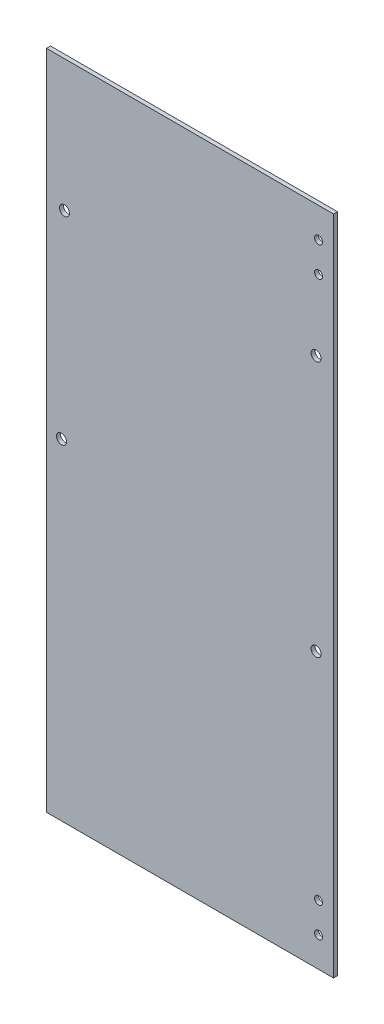
ISO-10303-21;
HEADER;
FILE_DESCRIPTION(('STEP AP214'),'2;1');
FILE_NAME('part.step','',(''),(''),'','','');
FILE_SCHEMA(('AUTOMOTIVE_DESIGN { 1 0 10303 214 1 1 1 1 }'));
ENDSEC;
DATA;
#1=APPLICATION_CONTEXT('core data for automotive mechanical design processes');
#2=APPLICATION_PROTOCOL_DEFINITION('international standard','automotive_design',2000,#1);
#3=PRODUCT_CONTEXT('',#1,'mechanical');
#4=PRODUCT('Part','Part','',(#3));
#5=PRODUCT_RELATED_PRODUCT_CATEGORY('part','',(#4));
#6=PRODUCT_DEFINITION_FORMATION('','',#4);
#7=PRODUCT_DEFINITION_CONTEXT('part definition',#1,'design');
#8=PRODUCT_DEFINITION('design','',#6,#7);
#9=PRODUCT_DEFINITION_SHAPE('','',#8);
#10=(LENGTH_UNIT() NAMED_UNIT(*) SI_UNIT(.MILLI.,.METRE.));
#11=(NAMED_UNIT(*) PLANE_ANGLE_UNIT() SI_UNIT($,.RADIAN.));
#12=(NAMED_UNIT(*) SI_UNIT($,.STERADIAN.) SOLID_ANGLE_UNIT());
#13=UNCERTAINTY_MEASURE_WITH_UNIT(LENGTH_MEASURE(1.E-05),#10,'distance_accuracy_value','');
#14=(GEOMETRIC_REPRESENTATION_CONTEXT(3) GLOBAL_UNCERTAINTY_ASSIGNED_CONTEXT((#13)) GLOBAL_UNIT_ASSIGNED_CONTEXT((#10,
#11,#12)) REPRESENTATION_CONTEXT('',''));
#15=CARTESIAN_POINT('',(0.,0.,0.));
#16=DIRECTION('',(0.,0.,1.));
#17=DIRECTION('',(1.,0.,0.));
#18=AXIS2_PLACEMENT_3D('',#15,#16,#17);
#19=CARTESIAN_POINT('',(0.,0.,2.));
#20=DIRECTION('',(1.,0.,0.));
#21=DIRECTION('',(0.,1.,0.));
#22=AXIS2_PLACEMENT_3D('',#19,#20,#21);
#23=PLANE('',#22);
#24=DIRECTION('',(0.,-1.,0.));
#25=VECTOR('',#24,1.);
#26=CARTESIAN_POINT('',(0.,0.,0.));
#27=LINE('',#26,#25);
#28=CARTESIAN_POINT('',(0.,0.,0.));
#29=VERTEX_POINT('',#28);
#30=CARTESIAN_POINT('',(0.,-332.,0.));
#31=VERTEX_POINT('',#30);
#32=EDGE_CURVE('E98',#29,#31,#27,.T.);
#33=ORIENTED_EDGE('',*,*,#32,.T.);
#34=DIRECTION('',(0.,0.,-1.));
#35=VECTOR('',#34,1.);
#36=CARTESIAN_POINT('',(0.,-332.,2.));
#37=LINE('',#36,#35);
#38=CARTESIAN_POINT('',(0.,-332.,2.));
#39=VERTEX_POINT('',#38);
#40=EDGE_CURVE('E11',#39,#31,#37,.T.);
#41=ORIENTED_EDGE('',*,*,#40,.F.);
#42=DIRECTION('',(0.,-1.,0.));
#43=VECTOR('',#42,1.);
#44=CARTESIAN_POINT('',(0.,0.,2.));
#45=LINE('',#44,#43);
#46=CARTESIAN_POINT('',(0.,0.,2.));
#47=VERTEX_POINT('',#46);
#48=EDGE_CURVE('E86',#47,#39,#45,.T.);
#49=ORIENTED_EDGE('',*,*,#48,.F.);
#50=DIRECTION('',(0.,0.,-1.));
#51=VECTOR('',#50,1.);
#52=CARTESIAN_POINT('',(0.,0.,2.));
#53=LINE('',#52,#51);
#54=EDGE_CURVE('E94',#47,#29,#53,.T.);
#55=ORIENTED_EDGE('',*,*,#54,.T.);
#56=EDGE_LOOP('',(#33,#41,#49,#55));
#57=FACE_BOUND('',#56,.T.);
#58=ADVANCED_FACE('F35',(#57),#23,.F.);
#59=CARTESIAN_POINT('',(0.,-332.,2.));
#60=DIRECTION('',(0.,1.,0.));
#61=DIRECTION('',(0.,0.,1.));
#62=AXIS2_PLACEMENT_3D('',#59,#60,#61);
#63=PLANE('',#62);
#64=DIRECTION('',(1.,0.,0.));
#65=VECTOR('',#64,1.);
#66=CARTESIAN_POINT('',(0.,-332.,0.));
#67=LINE('',#66,#65);
#68=CARTESIAN_POINT('',(144.,-332.,0.));
#69=VERTEX_POINT('',#68);
#70=EDGE_CURVE('E90',#31,#69,#67,.T.);
#71=ORIENTED_EDGE('',*,*,#70,.T.);
#72=DIRECTION('',(0.,0.,-1.));
#73=VECTOR('',#72,1.);
#74=CARTESIAN_POINT('',(144.,-332.,2.));
#75=LINE('',#74,#73);
#76=CARTESIAN_POINT('',(144.,-332.,2.));
#77=VERTEX_POINT('',#76);
#78=EDGE_CURVE('E43',#77,#69,#75,.T.);
#79=ORIENTED_EDGE('',*,*,#78,.F.);
#80=DIRECTION('',(1.,0.,0.));
#81=VECTOR('',#80,1.);
#82=CARTESIAN_POINT('',(0.,-332.,2.));
#83=LINE('',#82,#81);
#84=EDGE_CURVE('E81',#39,#77,#83,.T.);
#85=ORIENTED_EDGE('',*,*,#84,.F.);
#86=ORIENTED_EDGE('',*,*,#40,.T.);
#87=EDGE_LOOP('',(#71,#79,#85,#86));
#88=FACE_BOUND('',#87,.T.);
#89=ADVANCED_FACE('F89',(#88),#63,.F.);
#90=CARTESIAN_POINT('',(144.,0.,2.));
#91=DIRECTION('',(-1.,0.,0.));
#92=DIRECTION('',(0.,-1.,0.));
#93=AXIS2_PLACEMENT_3D('',#90,#91,#92);
#94=PLANE('',#93);
#95=DIRECTION('',(0.,1.,0.));
#96=VECTOR('',#95,1.);
#97=CARTESIAN_POINT('',(144.,0.,0.));
#98=LINE('',#97,#96);
#99=CARTESIAN_POINT('',(144.,0.,0.));
#100=VERTEX_POINT('',#99);
#101=EDGE_CURVE('E68',#69,#100,#98,.T.);
#102=ORIENTED_EDGE('',*,*,#101,.T.);
#103=DIRECTION('',(0.,0.,-1.));
#104=VECTOR('',#103,1.);
#105=CARTESIAN_POINT('',(144.,0.,2.));
#106=LINE('',#105,#104);
#107=CARTESIAN_POINT('',(144.,0.,2.));
#108=VERTEX_POINT('',#107);
#109=EDGE_CURVE('E91',#108,#100,#106,.T.);
#110=ORIENTED_EDGE('',*,*,#109,.F.);
#111=DIRECTION('',(0.,1.,0.));
#112=VECTOR('',#111,1.);
#113=CARTESIAN_POINT('',(144.,0.,2.));
#114=LINE('',#113,#112);
#115=EDGE_CURVE('E84',#77,#108,#114,.T.);
#116=ORIENTED_EDGE('',*,*,#115,.F.);
#117=ORIENTED_EDGE('',*,*,#78,.T.);
#118=EDGE_LOOP('',(#102,#110,#116,#117));
#119=FACE_BOUND('',#118,.T.);
#120=ADVANCED_FACE('F92',(#119),#94,.F.);
#121=CARTESIAN_POINT('',(0.,0.,2.));
#122=DIRECTION('',(0.,-1.,0.));
#123=DIRECTION('',(0.,0.,-1.));
#124=AXIS2_PLACEMENT_3D('',#121,#122,#123);
#125=PLANE('',#124);
#126=DIRECTION('',(-1.,0.,0.));
#127=VECTOR('',#126,1.);
#128=CARTESIAN_POINT('',(0.,0.,0.));
#129=LINE('',#128,#127);
#130=EDGE_CURVE('E74',#100,#29,#129,.T.);
#131=ORIENTED_EDGE('',*,*,#130,.T.);
#132=ORIENTED_EDGE('',*,*,#54,.F.);
#133=DIRECTION('',(-1.,0.,0.));
#134=VECTOR('',#133,1.);
#135=CARTESIAN_POINT('',(0.,0.,2.));
#136=LINE('',#135,#134);
#137=EDGE_CURVE('E51',#108,#47,#136,.T.);
#138=ORIENTED_EDGE('',*,*,#137,.F.);
#139=ORIENTED_EDGE('',*,*,#109,.T.);
#140=EDGE_LOOP('',(#131,#132,#138,#139));
#141=FACE_BOUND('',#140,.T.);
#142=ADVANCED_FACE('F106',(#141),#125,.F.);
#143=CARTESIAN_POINT('',(0.,0.,2.));
#144=DIRECTION('',(0.,0.,1.));
#145=DIRECTION('',(1.,0.,0.));
#146=AXIS2_PLACEMENT_3D('',#143,#144,#145);
#147=PLANE('',#146);
#148=CARTESIAN_POINT('',(136.5,-15.,2.));
#149=DIRECTION('',(0.,0.,1.));
#150=DIRECTION('',(1.,0.,0.));
#151=AXIS2_PLACEMENT_3D('',#148,#149,#150);
#152=CIRCLE('',#151,2.);
#153=CARTESIAN_POINT('',(138.5,-15.,2.));
#154=VERTEX_POINT('',#153);
#155=EDGE_CURVE('E116',#154,#154,#152,.T.);
#156=ORIENTED_EDGE('',*,*,#155,.F.);
#157=EDGE_LOOP('',(#156));
#158=FACE_BOUND('',#157,.T.);
#159=CARTESIAN_POINT('',(7.49999999999998,-166.,2.));
#160=DIRECTION('',(0.,0.,1.));
#161=DIRECTION('',(1.,0.,0.));
#162=AXIS2_PLACEMENT_3D('',#159,#160,#161);
#163=CIRCLE('',#162,2.5);
#164=CARTESIAN_POINT('',(9.99999999999998,-166.,2.));
#165=VERTEX_POINT('',#164);
#166=EDGE_CURVE('E132',#165,#165,#163,.T.);
#167=ORIENTED_EDGE('',*,*,#166,.F.);
#168=EDGE_LOOP('',(#167));
#169=FACE_BOUND('',#168,.T.);
#170=CARTESIAN_POINT('',(136.5,-317.,2.));
#171=DIRECTION('',(0.,0.,1.));
#172=DIRECTION('',(1.,0.,0.));
#173=AXIS2_PLACEMENT_3D('',#170,#171,#172);
#174=CIRCLE('',#173,2.);
#175=CARTESIAN_POINT('',(138.5,-317.,2.));
#176=VERTEX_POINT('',#175);
#177=EDGE_CURVE('E135',#176,#176,#174,.T.);
#178=ORIENTED_EDGE('',*,*,#177,.F.);
#179=EDGE_LOOP('',(#178));
#180=FACE_BOUND('',#179,.T.);
#181=CARTESIAN_POINT('',(136.5,-302.,2.));
#182=DIRECTION('',(0.,0.,1.));
#183=DIRECTION('',(1.,0.,0.));
#184=AXIS2_PLACEMENT_3D('',#181,#182,#183);
#185=CIRCLE('',#184,2.);
#186=CARTESIAN_POINT('',(138.5,-302.,2.));
#187=VERTEX_POINT('',#186);
#188=EDGE_CURVE('E138',#187,#187,#185,.T.);
#189=ORIENTED_EDGE('',*,*,#188,.F.);
#190=EDGE_LOOP('',(#189));
#191=FACE_BOUND('',#190,.T.);
#192=CARTESIAN_POINT('',(136.5,-30.,2.));
#193=DIRECTION('',(0.,0.,1.));
#194=DIRECTION('',(1.,0.,0.));
#195=AXIS2_PLACEMENT_3D('',#192,#193,#194);
#196=CIRCLE('',#195,2.);
#197=CARTESIAN_POINT('',(138.5,-30.,2.));
#198=VERTEX_POINT('',#197);
#199=EDGE_CURVE('E141',#198,#198,#196,.T.);
#200=ORIENTED_EDGE('',*,*,#199,.F.);
#201=EDGE_LOOP('',(#200));
#202=FACE_BOUND('',#201,.T.);
#203=CARTESIAN_POINT('',(9.,-66.,2.));
#204=DIRECTION('',(0.,0.,1.));
#205=DIRECTION('',(1.,0.,0.));
#206=AXIS2_PLACEMENT_3D('',#203,#204,#205);
#207=CIRCLE('',#206,2.5);
#208=CARTESIAN_POINT('',(11.5,-66.,2.));
#209=VERTEX_POINT('',#208);
#210=EDGE_CURVE('E125',#209,#209,#207,.T.);
#211=ORIENTED_EDGE('',*,*,#210,.F.);
#212=EDGE_LOOP('',(#211));
#213=FACE_BOUND('',#212,.T.);
#214=CARTESIAN_POINT('',(135.26,-66.,2.));
#215=DIRECTION('',(0.,0.,1.));
#216=DIRECTION('',(-1.,0.,0.));
#217=AXIS2_PLACEMENT_3D('',#214,#215,#216);
#218=CIRCLE('',#217,2.5);
#219=CARTESIAN_POINT('',(132.76,-66.,2.));
#220=VERTEX_POINT('',#219);
#221=EDGE_CURVE('E119',#220,#220,#218,.T.);
#222=ORIENTED_EDGE('',*,*,#221,.F.);
#223=EDGE_LOOP('',(#222));
#224=FACE_BOUND('',#223,.T.);
#225=CARTESIAN_POINT('',(135.26,-194.4,2.));
#226=DIRECTION('',(0.,0.,1.));
#227=DIRECTION('',(1.,0.,0.));
#228=AXIS2_PLACEMENT_3D('',#225,#226,#227);
#229=CIRCLE('',#228,2.5);
#230=CARTESIAN_POINT('',(137.76,-194.4,2.));
#231=VERTEX_POINT('',#230);
#232=EDGE_CURVE('E112',#231,#231,#229,.T.);
#233=ORIENTED_EDGE('',*,*,#232,.F.);
#234=EDGE_LOOP('',(#233));
#235=FACE_BOUND('',#234,.T.);
#236=ORIENTED_EDGE('',*,*,#48,.T.);
#237=ORIENTED_EDGE('',*,*,#84,.T.);
#238=ORIENTED_EDGE('',*,*,#115,.T.);
#239=ORIENTED_EDGE('',*,*,#137,.T.);
#240=EDGE_LOOP('',(#236,#237,#238,#239));
#241=FACE_BOUND('',#240,.T.);
#242=ADVANCED_FACE('F82',(#158,#169,#180,#191,#202,#213,#224,#235,#241),#147,.T.);
#243=CARTESIAN_POINT('',(0.,0.,0.));
#244=DIRECTION('',(0.,0.,1.));
#245=DIRECTION('',(1.,0.,0.));
#246=AXIS2_PLACEMENT_3D('',#243,#244,#245);
#247=PLANE('',#246);
#248=CARTESIAN_POINT('',(136.5,-15.,0.));
#249=DIRECTION('',(0.,0.,-1.));
#250=DIRECTION('',(-1.,0.,0.));
#251=AXIS2_PLACEMENT_3D('',#248,#249,#250);
#252=CIRCLE('',#251,2.);
#253=CARTESIAN_POINT('',(134.5,-15.,0.));
#254=VERTEX_POINT('',#253);
#255=EDGE_CURVE('E144',#254,#254,#252,.T.);
#256=ORIENTED_EDGE('',*,*,#255,.F.);
#257=EDGE_LOOP('',(#256));
#258=FACE_BOUND('',#257,.T.);
#259=CARTESIAN_POINT('',(7.49999999999998,-166.,0.));
#260=DIRECTION('',(0.,0.,-1.));
#261=DIRECTION('',(-1.,0.,0.));
#262=AXIS2_PLACEMENT_3D('',#259,#260,#261);
#263=CIRCLE('',#262,2.5);
#264=CARTESIAN_POINT('',(4.99999999999998,-166.,0.));
#265=VERTEX_POINT('',#264);
#266=EDGE_CURVE('E152',#265,#265,#263,.T.);
#267=ORIENTED_EDGE('',*,*,#266,.F.);
#268=EDGE_LOOP('',(#267));
#269=FACE_BOUND('',#268,.T.);
#270=CARTESIAN_POINT('',(136.5,-317.,0.));
#271=DIRECTION('',(0.,0.,-1.));
#272=DIRECTION('',(1.,0.,0.));
#273=AXIS2_PLACEMENT_3D('',#270,#271,#272);
#274=CIRCLE('',#273,2.);
#275=CARTESIAN_POINT('',(138.5,-317.,0.));
#276=VERTEX_POINT('',#275);
#277=EDGE_CURVE('E149',#276,#276,#274,.T.);
#278=ORIENTED_EDGE('',*,*,#277,.F.);
#279=EDGE_LOOP('',(#278));
#280=FACE_BOUND('',#279,.T.);
#281=CARTESIAN_POINT('',(136.5,-302.,0.));
#282=DIRECTION('',(0.,0.,-1.));
#283=DIRECTION('',(1.,0.,0.));
#284=AXIS2_PLACEMENT_3D('',#281,#282,#283);
#285=CIRCLE('',#284,2.);
#286=CARTESIAN_POINT('',(138.5,-302.,0.));
#287=VERTEX_POINT('',#286);
#288=EDGE_CURVE('E145',#287,#287,#285,.T.);
#289=ORIENTED_EDGE('',*,*,#288,.F.);
#290=EDGE_LOOP('',(#289));
#291=FACE_BOUND('',#290,.T.);
#292=CARTESIAN_POINT('',(136.5,-30.,0.));
#293=DIRECTION('',(0.,0.,-1.));
#294=DIRECTION('',(-1.,0.,0.));
#295=AXIS2_PLACEMENT_3D('',#292,#293,#294);
#296=CIRCLE('',#295,2.);
#297=CARTESIAN_POINT('',(134.5,-30.,0.));
#298=VERTEX_POINT('',#297);
#299=EDGE_CURVE('E148',#298,#298,#296,.T.);
#300=ORIENTED_EDGE('',*,*,#299,.F.);
#301=EDGE_LOOP('',(#300));
#302=FACE_BOUND('',#301,.T.);
#303=CARTESIAN_POINT('',(9.,-66.,0.));
#304=DIRECTION('',(0.,0.,1.));
#305=DIRECTION('',(1.,0.,0.));
#306=AXIS2_PLACEMENT_3D('',#303,#304,#305);
#307=CIRCLE('',#306,2.5);
#308=CARTESIAN_POINT('',(11.5,-66.,0.));
#309=VERTEX_POINT('',#308);
#310=EDGE_CURVE('E101',#309,#309,#307,.T.);
#311=ORIENTED_EDGE('',*,*,#310,.T.);
#312=EDGE_LOOP('',(#311));
#313=FACE_BOUND('',#312,.T.);
#314=CARTESIAN_POINT('',(135.26,-66.,0.));
#315=DIRECTION('',(0.,0.,1.));
#316=DIRECTION('',(-1.,0.,0.));
#317=AXIS2_PLACEMENT_3D('',#314,#315,#316);
#318=CIRCLE('',#317,2.5);
#319=CARTESIAN_POINT('',(132.76,-66.,0.));
#320=VERTEX_POINT('',#319);
#321=EDGE_CURVE('E122',#320,#320,#318,.T.);
#322=ORIENTED_EDGE('',*,*,#321,.T.);
#323=EDGE_LOOP('',(#322));
#324=FACE_BOUND('',#323,.T.);
#325=CARTESIAN_POINT('',(135.26,-194.4,0.));
#326=DIRECTION('',(0.,0.,1.));
#327=DIRECTION('',(1.,0.,0.));
#328=AXIS2_PLACEMENT_3D('',#325,#326,#327);
#329=CIRCLE('',#328,2.5);
#330=CARTESIAN_POINT('',(137.76,-194.4,0.));
#331=VERTEX_POINT('',#330);
#332=EDGE_CURVE('E115',#331,#331,#329,.T.);
#333=ORIENTED_EDGE('',*,*,#332,.T.);
#334=EDGE_LOOP('',(#333));
#335=FACE_BOUND('',#334,.T.);
#336=ORIENTED_EDGE('',*,*,#32,.F.);
#337=ORIENTED_EDGE('',*,*,#130,.F.);
#338=ORIENTED_EDGE('',*,*,#101,.F.);
#339=ORIENTED_EDGE('',*,*,#70,.F.);
#340=EDGE_LOOP('',(#336,#337,#338,#339));
#341=FACE_BOUND('',#340,.T.);
#342=ADVANCED_FACE('F109',(#258,#269,#280,#291,#302,#313,#324,#335,#341),#247,.F.);
#343=CARTESIAN_POINT('',(135.26,-194.4,0.));
#344=DIRECTION('',(0.,0.,1.));
#345=DIRECTION('',(1.,0.,0.));
#346=AXIS2_PLACEMENT_3D('',#343,#344,#345);
#347=CYLINDRICAL_SURFACE('',#346,2.5);
#348=ORIENTED_EDGE('',*,*,#332,.F.);
#349=EDGE_LOOP('',(#348));
#350=FACE_BOUND('',#349,.T.);
#351=ORIENTED_EDGE('',*,*,#232,.T.);
#352=EDGE_LOOP('',(#351));
#353=FACE_BOUND('',#352,.T.);
#354=ADVANCED_FACE('F164',(#350,#353),#347,.F.);
#355=CARTESIAN_POINT('',(135.26,-66.,0.));
#356=DIRECTION('',(0.,0.,1.));
#357=DIRECTION('',(1.,0.,0.));
#358=AXIS2_PLACEMENT_3D('',#355,#356,#357);
#359=CYLINDRICAL_SURFACE('',#358,2.5);
#360=ORIENTED_EDGE('',*,*,#321,.F.);
#361=EDGE_LOOP('',(#360));
#362=FACE_BOUND('',#361,.T.);
#363=ORIENTED_EDGE('',*,*,#221,.T.);
#364=EDGE_LOOP('',(#363));
#365=FACE_BOUND('',#364,.T.);
#366=ADVANCED_FACE('F182',(#362,#365),#359,.F.);
#367=CARTESIAN_POINT('',(9.,-66.,0.));
#368=DIRECTION('',(0.,0.,1.));
#369=DIRECTION('',(1.,0.,0.));
#370=AXIS2_PLACEMENT_3D('',#367,#368,#369);
#371=CYLINDRICAL_SURFACE('',#370,2.5);
#372=ORIENTED_EDGE('',*,*,#310,.F.);
#373=EDGE_LOOP('',(#372));
#374=FACE_BOUND('',#373,.T.);
#375=ORIENTED_EDGE('',*,*,#210,.T.);
#376=EDGE_LOOP('',(#375));
#377=FACE_BOUND('',#376,.T.);
#378=ADVANCED_FACE('F231',(#374,#377),#371,.F.);
#379=CARTESIAN_POINT('',(136.5,-30.,10.));
#380=DIRECTION('',(0.,0.,-1.));
#381=DIRECTION('',(-1.,0.,0.));
#382=AXIS2_PLACEMENT_3D('',#379,#380,#381);
#383=CYLINDRICAL_SURFACE('',#382,2.);
#384=ORIENTED_EDGE('',*,*,#199,.T.);
#385=EDGE_LOOP('',(#384));
#386=FACE_BOUND('',#385,.T.);
#387=ORIENTED_EDGE('',*,*,#299,.T.);
#388=EDGE_LOOP('',(#387));
#389=FACE_BOUND('',#388,.T.);
#390=ADVANCED_FACE('F238',(#386,#389),#383,.F.);
#391=CARTESIAN_POINT('',(136.5,-302.,10.));
#392=DIRECTION('',(0.,0.,-1.));
#393=DIRECTION('',(-1.,0.,0.));
#394=AXIS2_PLACEMENT_3D('',#391,#392,#393);
#395=CYLINDRICAL_SURFACE('',#394,2.);
#396=ORIENTED_EDGE('',*,*,#188,.T.);
#397=EDGE_LOOP('',(#396));
#398=FACE_BOUND('',#397,.T.);
#399=ORIENTED_EDGE('',*,*,#288,.T.);
#400=EDGE_LOOP('',(#399));
#401=FACE_BOUND('',#400,.T.);
#402=ADVANCED_FACE('F245',(#398,#401),#395,.F.);
#403=CARTESIAN_POINT('',(136.5,-317.,10.));
#404=DIRECTION('',(0.,0.,-1.));
#405=DIRECTION('',(-1.,0.,0.));
#406=AXIS2_PLACEMENT_3D('',#403,#404,#405);
#407=CYLINDRICAL_SURFACE('',#406,2.);
#408=ORIENTED_EDGE('',*,*,#177,.T.);
#409=EDGE_LOOP('',(#408));
#410=FACE_BOUND('',#409,.T.);
#411=ORIENTED_EDGE('',*,*,#277,.T.);
#412=EDGE_LOOP('',(#411));
#413=FACE_BOUND('',#412,.T.);
#414=ADVANCED_FACE('F253',(#410,#413),#407,.F.);
#415=CARTESIAN_POINT('',(7.49999999999998,-166.,10.));
#416=DIRECTION('',(0.,0.,-1.));
#417=DIRECTION('',(-1.,0.,0.));
#418=AXIS2_PLACEMENT_3D('',#415,#416,#417);
#419=CYLINDRICAL_SURFACE('',#418,2.5);
#420=ORIENTED_EDGE('',*,*,#166,.T.);
#421=EDGE_LOOP('',(#420));
#422=FACE_BOUND('',#421,.T.);
#423=ORIENTED_EDGE('',*,*,#266,.T.);
#424=EDGE_LOOP('',(#423));
#425=FACE_BOUND('',#424,.T.);
#426=ADVANCED_FACE('F261',(#422,#425),#419,.F.);
#427=CARTESIAN_POINT('',(136.5,-15.,10.));
#428=DIRECTION('',(0.,0.,-1.));
#429=DIRECTION('',(-1.,0.,0.));
#430=AXIS2_PLACEMENT_3D('',#427,#428,#429);
#431=CYLINDRICAL_SURFACE('',#430,2.);
#432=ORIENTED_EDGE('',*,*,#155,.T.);
#433=EDGE_LOOP('',(#432));
#434=FACE_BOUND('',#433,.T.);
#435=ORIENTED_EDGE('',*,*,#255,.T.);
#436=EDGE_LOOP('',(#435));
#437=FACE_BOUND('',#436,.T.);
#438=ADVANCED_FACE('F160',(#434,#437),#431,.F.);
#439=CLOSED_SHELL('',(#58,#89,#120,#142,#242,#342,#354,#366,#378,#390,#402,#414,#426,#438));
#440=MANIFOLD_SOLID_BREP('B2',#439);
#441=ADVANCED_BREP_SHAPE_REPRESENTATION('',(#18,#440),#14);
#442=SHAPE_DEFINITION_REPRESENTATION(#9,#441);
ENDSEC;
END-ISO-10303-21;
